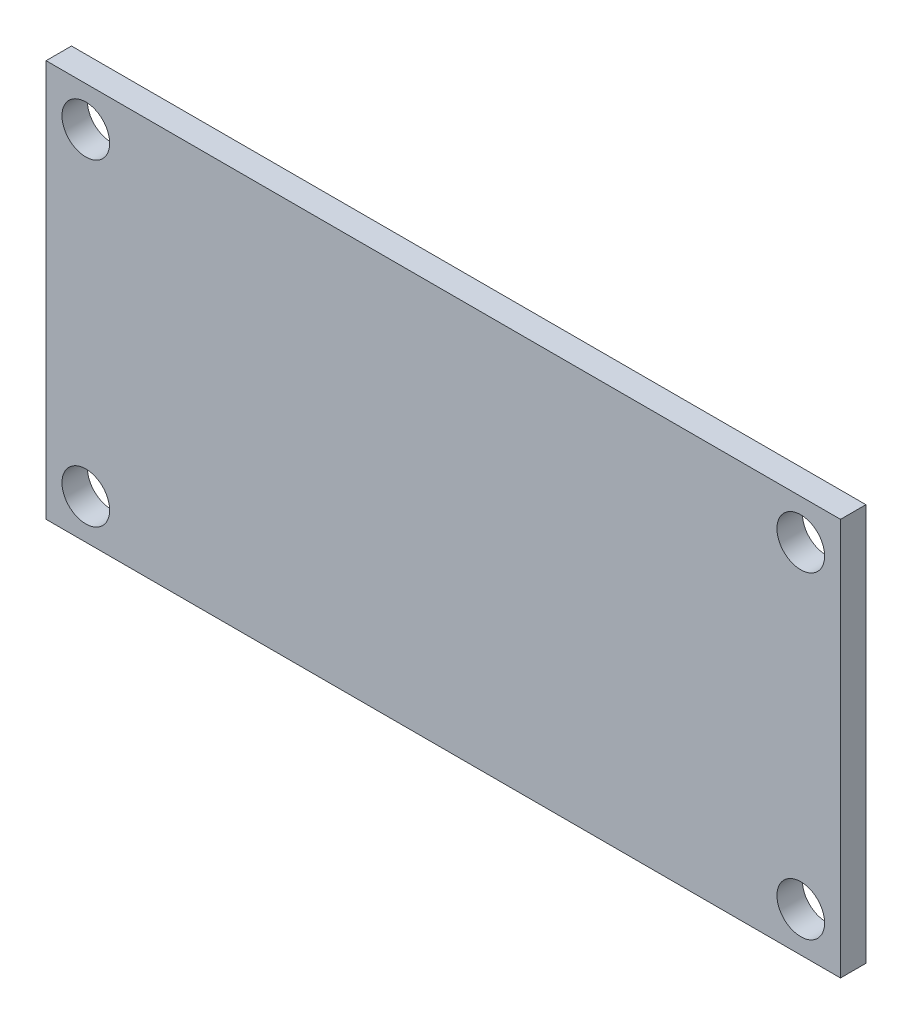
ISO-10303-21;
HEADER;
FILE_DESCRIPTION(('STEP AP214'),'2;1');
FILE_NAME('part.step','',(''),(''),'','','');
FILE_SCHEMA(('AUTOMOTIVE_DESIGN { 1 0 10303 214 1 1 1 1 }'));
ENDSEC;
DATA;
#1=APPLICATION_CONTEXT('core data for automotive mechanical design processes');
#2=APPLICATION_PROTOCOL_DEFINITION('international standard','automotive_design',2000,#1);
#3=PRODUCT_CONTEXT('',#1,'mechanical');
#4=PRODUCT('Part','Part','',(#3));
#5=PRODUCT_RELATED_PRODUCT_CATEGORY('part','',(#4));
#6=PRODUCT_DEFINITION_FORMATION('','',#4);
#7=PRODUCT_DEFINITION_CONTEXT('part definition',#1,'design');
#8=PRODUCT_DEFINITION('design','',#6,#7);
#9=PRODUCT_DEFINITION_SHAPE('','',#8);
#10=(LENGTH_UNIT() NAMED_UNIT(*) SI_UNIT(.MILLI.,.METRE.));
#11=(NAMED_UNIT(*) PLANE_ANGLE_UNIT() SI_UNIT($,.RADIAN.));
#12=(NAMED_UNIT(*) SI_UNIT($,.STERADIAN.) SOLID_ANGLE_UNIT());
#13=UNCERTAINTY_MEASURE_WITH_UNIT(LENGTH_MEASURE(1.E-05),#10,'distance_accuracy_value','');
#14=(GEOMETRIC_REPRESENTATION_CONTEXT(3) GLOBAL_UNCERTAINTY_ASSIGNED_CONTEXT((#13)) GLOBAL_UNIT_ASSIGNED_CONTEXT((#10,
#11,#12)) REPRESENTATION_CONTEXT('',''));
#15=CARTESIAN_POINT('',(0.,0.,0.));
#16=DIRECTION('',(0.,0.,1.));
#17=DIRECTION('',(1.,0.,0.));
#18=AXIS2_PLACEMENT_3D('',#15,#16,#17);
#19=CARTESIAN_POINT('',(0.,0.,1.6));
#20=DIRECTION('',(1.,0.,0.));
#21=DIRECTION('',(0.,0.,-1.));
#22=AXIS2_PLACEMENT_3D('',#19,#20,#21);
#23=PLANE('',#22);
#24=DIRECTION('',(0.,-1.,0.));
#25=VECTOR('',#24,1.);
#26=CARTESIAN_POINT('',(0.,0.,0.));
#27=LINE('',#26,#25);
#28=CARTESIAN_POINT('',(0.,25.,0.));
#29=VERTEX_POINT('',#28);
#30=CARTESIAN_POINT('',(0.,0.,0.));
#31=VERTEX_POINT('',#30);
#32=EDGE_CURVE('E96',#29,#31,#27,.T.);
#33=ORIENTED_EDGE('',*,*,#32,.T.);
#34=DIRECTION('',(0.,0.,-1.));
#35=VECTOR('',#34,1.);
#36=CARTESIAN_POINT('',(0.,0.,1.6));
#37=LINE('',#36,#35);
#38=CARTESIAN_POINT('',(0.,0.,1.6));
#39=VERTEX_POINT('',#38);
#40=EDGE_CURVE('E11',#39,#31,#37,.T.);
#41=ORIENTED_EDGE('',*,*,#40,.F.);
#42=DIRECTION('',(0.,-1.,0.));
#43=VECTOR('',#42,1.);
#44=CARTESIAN_POINT('',(0.,0.,1.6));
#45=LINE('',#44,#43);
#46=CARTESIAN_POINT('',(0.,25.,1.6));
#47=VERTEX_POINT('',#46);
#48=EDGE_CURVE('E84',#47,#39,#45,.T.);
#49=ORIENTED_EDGE('',*,*,#48,.F.);
#50=DIRECTION('',(0.,0.,-1.));
#51=VECTOR('',#50,1.);
#52=CARTESIAN_POINT('',(0.,25.,1.6));
#53=LINE('',#52,#51);
#54=EDGE_CURVE('E92',#47,#29,#53,.T.);
#55=ORIENTED_EDGE('',*,*,#54,.T.);
#56=EDGE_LOOP('',(#33,#41,#49,#55));
#57=FACE_BOUND('',#56,.T.);
#58=ADVANCED_FACE('F33',(#57),#23,.F.);
#59=CARTESIAN_POINT('',(0.,0.,1.6));
#60=DIRECTION('',(0.,1.,0.));
#61=DIRECTION('',(0.,0.,1.));
#62=AXIS2_PLACEMENT_3D('',#59,#60,#61);
#63=PLANE('',#62);
#64=DIRECTION('',(1.,0.,0.));
#65=VECTOR('',#64,1.);
#66=CARTESIAN_POINT('',(0.,0.,0.));
#67=LINE('',#66,#65);
#68=CARTESIAN_POINT('',(50.,0.,0.));
#69=VERTEX_POINT('',#68);
#70=EDGE_CURVE('E88',#31,#69,#67,.T.);
#71=ORIENTED_EDGE('',*,*,#70,.T.);
#72=DIRECTION('',(0.,0.,-1.));
#73=VECTOR('',#72,1.);
#74=CARTESIAN_POINT('',(50.,0.,1.6));
#75=LINE('',#74,#73);
#76=CARTESIAN_POINT('',(50.,0.,1.6));
#77=VERTEX_POINT('',#76);
#78=EDGE_CURVE('E41',#77,#69,#75,.T.);
#79=ORIENTED_EDGE('',*,*,#78,.F.);
#80=DIRECTION('',(1.,0.,0.));
#81=VECTOR('',#80,1.);
#82=CARTESIAN_POINT('',(0.,0.,1.6));
#83=LINE('',#82,#81);
#84=EDGE_CURVE('E79',#39,#77,#83,.T.);
#85=ORIENTED_EDGE('',*,*,#84,.F.);
#86=ORIENTED_EDGE('',*,*,#40,.T.);
#87=EDGE_LOOP('',(#71,#79,#85,#86));
#88=FACE_BOUND('',#87,.T.);
#89=ADVANCED_FACE('F87',(#88),#63,.F.);
#90=CARTESIAN_POINT('',(50.,0.,1.6));
#91=DIRECTION('',(-1.,0.,0.));
#92=DIRECTION('',(0.,0.,1.));
#93=AXIS2_PLACEMENT_3D('',#90,#91,#92);
#94=PLANE('',#93);
#95=DIRECTION('',(0.,1.,0.));
#96=VECTOR('',#95,1.);
#97=CARTESIAN_POINT('',(50.,0.,0.));
#98=LINE('',#97,#96);
#99=CARTESIAN_POINT('',(50.,25.,0.));
#100=VERTEX_POINT('',#99);
#101=EDGE_CURVE('E66',#69,#100,#98,.T.);
#102=ORIENTED_EDGE('',*,*,#101,.T.);
#103=DIRECTION('',(0.,0.,-1.));
#104=VECTOR('',#103,1.);
#105=CARTESIAN_POINT('',(50.,25.,1.6));
#106=LINE('',#105,#104);
#107=CARTESIAN_POINT('',(50.,25.,1.6));
#108=VERTEX_POINT('',#107);
#109=EDGE_CURVE('E89',#108,#100,#106,.T.);
#110=ORIENTED_EDGE('',*,*,#109,.F.);
#111=DIRECTION('',(0.,1.,0.));
#112=VECTOR('',#111,1.);
#113=CARTESIAN_POINT('',(50.,0.,1.6));
#114=LINE('',#113,#112);
#115=EDGE_CURVE('E82',#77,#108,#114,.T.);
#116=ORIENTED_EDGE('',*,*,#115,.F.);
#117=ORIENTED_EDGE('',*,*,#78,.T.);
#118=EDGE_LOOP('',(#102,#110,#116,#117));
#119=FACE_BOUND('',#118,.T.);
#120=ADVANCED_FACE('F90',(#119),#94,.F.);
#121=CARTESIAN_POINT('',(0.,25.,1.6));
#122=DIRECTION('',(0.,-1.,0.));
#123=DIRECTION('',(0.,0.,-1.));
#124=AXIS2_PLACEMENT_3D('',#121,#122,#123);
#125=PLANE('',#124);
#126=DIRECTION('',(-1.,0.,0.));
#127=VECTOR('',#126,1.);
#128=CARTESIAN_POINT('',(0.,25.,0.));
#129=LINE('',#128,#127);
#130=EDGE_CURVE('E72',#100,#29,#129,.T.);
#131=ORIENTED_EDGE('',*,*,#130,.T.);
#132=ORIENTED_EDGE('',*,*,#54,.F.);
#133=DIRECTION('',(-1.,0.,0.));
#134=VECTOR('',#133,1.);
#135=CARTESIAN_POINT('',(0.,25.,1.6));
#136=LINE('',#135,#134);
#137=EDGE_CURVE('E49',#108,#47,#136,.T.);
#138=ORIENTED_EDGE('',*,*,#137,.F.);
#139=ORIENTED_EDGE('',*,*,#109,.T.);
#140=EDGE_LOOP('',(#131,#132,#138,#139));
#141=FACE_BOUND('',#140,.T.);
#142=ADVANCED_FACE('F104',(#141),#125,.F.);
#143=CARTESIAN_POINT('',(0.,0.,1.6));
#144=DIRECTION('',(0.,0.,-1.));
#145=DIRECTION('',(-1.,0.,0.));
#146=AXIS2_PLACEMENT_3D('',#143,#144,#145);
#147=PLANE('',#146);
#148=CARTESIAN_POINT('',(47.5,2.5,1.6));
#149=DIRECTION('',(0.,0.,-1.));
#150=DIRECTION('',(-1.,0.,0.));
#151=AXIS2_PLACEMENT_3D('',#148,#149,#150);
#152=CIRCLE('',#151,1.5);
#153=CARTESIAN_POINT('',(46.,2.5,1.6));
#154=VERTEX_POINT('',#153);
#155=EDGE_CURVE('E113',#154,#154,#152,.T.);
#156=ORIENTED_EDGE('',*,*,#155,.T.);
#157=EDGE_LOOP('',(#156));
#158=FACE_BOUND('',#157,.T.);
#159=CARTESIAN_POINT('',(47.5,22.5,1.6));
#160=DIRECTION('',(0.,0.,-1.));
#161=DIRECTION('',(-1.,0.,0.));
#162=AXIS2_PLACEMENT_3D('',#159,#160,#161);
#163=CIRCLE('',#162,1.5);
#164=CARTESIAN_POINT('',(46.,22.5,1.6));
#165=VERTEX_POINT('',#164);
#166=EDGE_CURVE('E125',#165,#165,#163,.T.);
#167=ORIENTED_EDGE('',*,*,#166,.T.);
#168=EDGE_LOOP('',(#167));
#169=FACE_BOUND('',#168,.T.);
#170=CARTESIAN_POINT('',(2.5,22.5,1.6));
#171=DIRECTION('',(0.,0.,-1.));
#172=DIRECTION('',(-1.,0.,0.));
#173=AXIS2_PLACEMENT_3D('',#170,#171,#172);
#174=CIRCLE('',#173,1.5);
#175=CARTESIAN_POINT('',(1.,22.5,1.6));
#176=VERTEX_POINT('',#175);
#177=EDGE_CURVE('E119',#176,#176,#174,.T.);
#178=ORIENTED_EDGE('',*,*,#177,.T.);
#179=EDGE_LOOP('',(#178));
#180=FACE_BOUND('',#179,.T.);
#181=CARTESIAN_POINT('',(2.5,2.5,1.6));
#182=DIRECTION('',(0.,0.,-1.));
#183=DIRECTION('',(-1.,0.,0.));
#184=AXIS2_PLACEMENT_3D('',#181,#182,#183);
#185=CIRCLE('',#184,1.5);
#186=CARTESIAN_POINT('',(1.,2.5,1.6));
#187=VERTEX_POINT('',#186);
#188=EDGE_CURVE('E99',#187,#187,#185,.T.);
#189=ORIENTED_EDGE('',*,*,#188,.T.);
#190=EDGE_LOOP('',(#189));
#191=FACE_BOUND('',#190,.T.);
#192=ORIENTED_EDGE('',*,*,#48,.T.);
#193=ORIENTED_EDGE('',*,*,#84,.T.);
#194=ORIENTED_EDGE('',*,*,#115,.T.);
#195=ORIENTED_EDGE('',*,*,#137,.T.);
#196=EDGE_LOOP('',(#192,#193,#194,#195));
#197=FACE_BOUND('',#196,.T.);
#198=ADVANCED_FACE('F80',(#158,#169,#180,#191,#197),#147,.F.);
#199=CARTESIAN_POINT('',(0.,0.,0.));
#200=DIRECTION('',(0.,0.,-1.));
#201=DIRECTION('',(-1.,0.,0.));
#202=AXIS2_PLACEMENT_3D('',#199,#200,#201);
#203=PLANE('',#202);
#204=CARTESIAN_POINT('',(47.5,2.5,0.));
#205=DIRECTION('',(0.,0.,-1.));
#206=DIRECTION('',(-1.,0.,0.));
#207=AXIS2_PLACEMENT_3D('',#204,#205,#206);
#208=CIRCLE('',#207,1.5);
#209=CARTESIAN_POINT('',(46.,2.5,0.));
#210=VERTEX_POINT('',#209);
#211=EDGE_CURVE('E128',#210,#210,#208,.T.);
#212=ORIENTED_EDGE('',*,*,#211,.F.);
#213=EDGE_LOOP('',(#212));
#214=FACE_BOUND('',#213,.T.);
#215=CARTESIAN_POINT('',(47.5,22.5,0.));
#216=DIRECTION('',(0.,0.,-1.));
#217=DIRECTION('',(-1.,0.,0.));
#218=AXIS2_PLACEMENT_3D('',#215,#216,#217);
#219=CIRCLE('',#218,1.5);
#220=CARTESIAN_POINT('',(46.,22.5,0.));
#221=VERTEX_POINT('',#220);
#222=EDGE_CURVE('E122',#221,#221,#219,.T.);
#223=ORIENTED_EDGE('',*,*,#222,.F.);
#224=EDGE_LOOP('',(#223));
#225=FACE_BOUND('',#224,.T.);
#226=CARTESIAN_POINT('',(2.5,22.5,0.));
#227=DIRECTION('',(0.,0.,-1.));
#228=DIRECTION('',(-1.,0.,0.));
#229=AXIS2_PLACEMENT_3D('',#226,#227,#228);
#230=CIRCLE('',#229,1.5);
#231=CARTESIAN_POINT('',(1.,22.5,0.));
#232=VERTEX_POINT('',#231);
#233=EDGE_CURVE('E116',#232,#232,#230,.T.);
#234=ORIENTED_EDGE('',*,*,#233,.F.);
#235=EDGE_LOOP('',(#234));
#236=FACE_BOUND('',#235,.T.);
#237=CARTESIAN_POINT('',(2.5,2.5,0.));
#238=DIRECTION('',(0.,0.,-1.));
#239=DIRECTION('',(-1.,0.,0.));
#240=AXIS2_PLACEMENT_3D('',#237,#238,#239);
#241=CIRCLE('',#240,1.5);
#242=CARTESIAN_POINT('',(1.,2.5,0.));
#243=VERTEX_POINT('',#242);
#244=EDGE_CURVE('E110',#243,#243,#241,.T.);
#245=ORIENTED_EDGE('',*,*,#244,.F.);
#246=EDGE_LOOP('',(#245));
#247=FACE_BOUND('',#246,.T.);
#248=ORIENTED_EDGE('',*,*,#32,.F.);
#249=ORIENTED_EDGE('',*,*,#130,.F.);
#250=ORIENTED_EDGE('',*,*,#101,.F.);
#251=ORIENTED_EDGE('',*,*,#70,.F.);
#252=EDGE_LOOP('',(#248,#249,#250,#251));
#253=FACE_BOUND('',#252,.T.);
#254=ADVANCED_FACE('F107',(#214,#225,#236,#247,#253),#203,.T.);
#255=CARTESIAN_POINT('',(2.5,2.5,1.6));
#256=DIRECTION('',(0.,0.,-1.));
#257=DIRECTION('',(-1.,0.,0.));
#258=AXIS2_PLACEMENT_3D('',#255,#256,#257);
#259=CYLINDRICAL_SURFACE('',#258,1.5);
#260=ORIENTED_EDGE('',*,*,#188,.F.);
#261=EDGE_LOOP('',(#260));
#262=FACE_BOUND('',#261,.T.);
#263=ORIENTED_EDGE('',*,*,#244,.T.);
#264=EDGE_LOOP('',(#263));
#265=FACE_BOUND('',#264,.T.);
#266=ADVANCED_FACE('F145',(#262,#265),#259,.F.);
#267=CARTESIAN_POINT('',(2.5,22.5,1.6));
#268=DIRECTION('',(0.,0.,-1.));
#269=DIRECTION('',(-1.,0.,0.));
#270=AXIS2_PLACEMENT_3D('',#267,#268,#269);
#271=CYLINDRICAL_SURFACE('',#270,1.5);
#272=ORIENTED_EDGE('',*,*,#177,.F.);
#273=EDGE_LOOP('',(#272));
#274=FACE_BOUND('',#273,.T.);
#275=ORIENTED_EDGE('',*,*,#233,.T.);
#276=EDGE_LOOP('',(#275));
#277=FACE_BOUND('',#276,.T.);
#278=ADVANCED_FACE('F154',(#274,#277),#271,.F.);
#279=CARTESIAN_POINT('',(47.5,22.5,1.6));
#280=DIRECTION('',(0.,0.,-1.));
#281=DIRECTION('',(-1.,0.,0.));
#282=AXIS2_PLACEMENT_3D('',#279,#280,#281);
#283=CYLINDRICAL_SURFACE('',#282,1.5);
#284=ORIENTED_EDGE('',*,*,#166,.F.);
#285=EDGE_LOOP('',(#284));
#286=FACE_BOUND('',#285,.T.);
#287=ORIENTED_EDGE('',*,*,#222,.T.);
#288=EDGE_LOOP('',(#287));
#289=FACE_BOUND('',#288,.T.);
#290=ADVANCED_FACE('F139',(#286,#289),#283,.F.);
#291=CARTESIAN_POINT('',(47.5,2.5,1.6));
#292=DIRECTION('',(0.,0.,-1.));
#293=DIRECTION('',(-1.,0.,0.));
#294=AXIS2_PLACEMENT_3D('',#291,#292,#293);
#295=CYLINDRICAL_SURFACE('',#294,1.5);
#296=ORIENTED_EDGE('',*,*,#155,.F.);
#297=EDGE_LOOP('',(#296));
#298=FACE_BOUND('',#297,.T.);
#299=ORIENTED_EDGE('',*,*,#211,.T.);
#300=EDGE_LOOP('',(#299));
#301=FACE_BOUND('',#300,.T.);
#302=ADVANCED_FACE('F136',(#298,#301),#295,.F.);
#303=CLOSED_SHELL('',(#58,#89,#120,#142,#198,#254,#266,#278,#290,#302));
#304=MANIFOLD_SOLID_BREP('B2',#303);
#305=ADVANCED_BREP_SHAPE_REPRESENTATION('',(#18,#304),#14);
#306=SHAPE_DEFINITION_REPRESENTATION(#9,#305);
ENDSEC;
END-ISO-10303-21;
